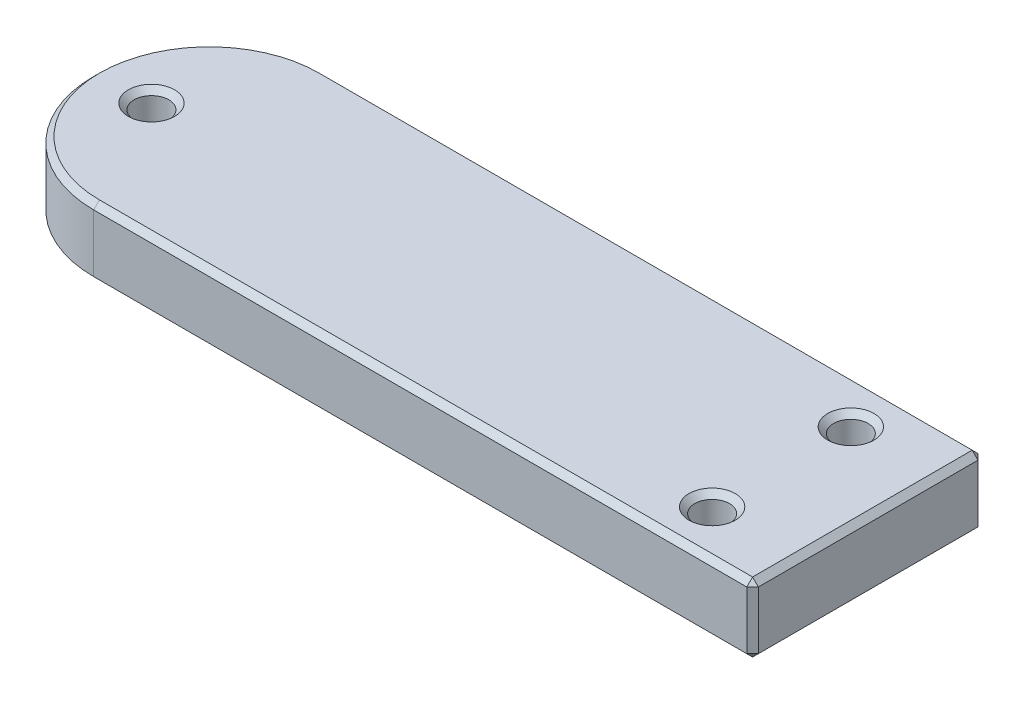
ISO-10303-21;
HEADER;
FILE_DESCRIPTION(('STEP AP214'),'2;1');
FILE_NAME('part.step','',(''),(''),'','','');
FILE_SCHEMA(('AUTOMOTIVE_DESIGN { 1 0 10303 214 1 1 1 1 }'));
ENDSEC;
DATA;
#1=APPLICATION_CONTEXT('core data for automotive mechanical design processes');
#2=APPLICATION_PROTOCOL_DEFINITION('international standard','automotive_design',2000,#1);
#3=PRODUCT_CONTEXT('',#1,'mechanical');
#4=PRODUCT('Part','Part','',(#3));
#5=PRODUCT_RELATED_PRODUCT_CATEGORY('part','',(#4));
#6=PRODUCT_DEFINITION_FORMATION('','',#4);
#7=PRODUCT_DEFINITION_CONTEXT('part definition',#1,'design');
#8=PRODUCT_DEFINITION('design','',#6,#7);
#9=PRODUCT_DEFINITION_SHAPE('','',#8);
#10=(LENGTH_UNIT() NAMED_UNIT(*) SI_UNIT(.MILLI.,.METRE.));
#11=(NAMED_UNIT(*) PLANE_ANGLE_UNIT() SI_UNIT($,.RADIAN.));
#12=(NAMED_UNIT(*) SI_UNIT($,.STERADIAN.) SOLID_ANGLE_UNIT());
#13=UNCERTAINTY_MEASURE_WITH_UNIT(LENGTH_MEASURE(1.E-05),#10,'distance_accuracy_value','');
#14=(GEOMETRIC_REPRESENTATION_CONTEXT(3) GLOBAL_UNCERTAINTY_ASSIGNED_CONTEXT((#13)) GLOBAL_UNIT_ASSIGNED_CONTEXT((#10,
#11,#12)) REPRESENTATION_CONTEXT('',''));
#15=CARTESIAN_POINT('',(0.,0.,0.));
#16=DIRECTION('',(0.,0.,1.));
#17=DIRECTION('',(1.,0.,0.));
#18=AXIS2_PLACEMENT_3D('',#15,#16,#17);
#19=CARTESIAN_POINT('',(0.,6.,0.));
#20=DIRECTION('',(0.,-1.,0.));
#21=DIRECTION('',(0.,0.,-1.));
#22=AXIS2_PLACEMENT_3D('',#19,#20,#21);
#23=PLANE('',#22);
#24=CARTESIAN_POINT('',(54.5,6.,6.));
#25=DIRECTION('',(0.,-1.,0.));
#26=DIRECTION('',(0.,0.,-1.));
#27=AXIS2_PLACEMENT_3D('',#24,#25,#26);
#28=CIRCLE('',#27,1.99999999999999);
#29=CARTESIAN_POINT('',(54.5,6.,4.00000000000001));
#30=VERTEX_POINT('',#29);
#31=EDGE_CURVE('E213',#30,#30,#28,.T.);
#32=ORIENTED_EDGE('',*,*,#31,.T.);
#33=EDGE_LOOP('',(#32));
#34=FACE_BOUND('',#33,.T.);
#35=CARTESIAN_POINT('',(0.,6.,0.));
#36=DIRECTION('',(0.,-1.,0.));
#37=DIRECTION('',(0.,0.,-1.));
#38=AXIS2_PLACEMENT_3D('',#35,#36,#37);
#39=CIRCLE('',#38,1.99999999999999);
#40=CARTESIAN_POINT('',(0.,6.,-1.99999999999999));
#41=VERTEX_POINT('',#40);
#42=EDGE_CURVE('E216',#41,#41,#39,.T.);
#43=ORIENTED_EDGE('',*,*,#42,.T.);
#44=EDGE_LOOP('',(#43));
#45=FACE_BOUND('',#44,.T.);
#46=DIRECTION('',(1.,0.,0.));
#47=VECTOR('',#46,1.);
#48=CARTESIAN_POINT('',(0.,6.,9.5));
#49=LINE('',#48,#47);
#50=CARTESIAN_POINT('',(5.,6.,9.5));
#51=VERTEX_POINT('',#50);
#52=CARTESIAN_POINT('',(61.5,6.,9.49999999999999));
#53=VERTEX_POINT('',#52);
#54=EDGE_CURVE('E222',#51,#53,#49,.T.);
#55=ORIENTED_EDGE('',*,*,#54,.T.);
#56=DIRECTION('',(0.,0.,-1.));
#57=VECTOR('',#56,1.);
#58=CARTESIAN_POINT('',(61.5,6.,0.));
#59=LINE('',#58,#57);
#60=CARTESIAN_POINT('',(61.5,6.,-9.49999999999999));
#61=VERTEX_POINT('',#60);
#62=EDGE_CURVE('E219',#53,#61,#59,.T.);
#63=ORIENTED_EDGE('',*,*,#62,.T.);
#64=DIRECTION('',(-1.,0.,0.));
#65=VECTOR('',#64,1.);
#66=CARTESIAN_POINT('',(0.,6.,-9.49999999999998));
#67=LINE('',#66,#65);
#68=CARTESIAN_POINT('',(5.,6.,-9.49999999999998));
#69=VERTEX_POINT('',#68);
#70=EDGE_CURVE('E228',#61,#69,#67,.T.);
#71=ORIENTED_EDGE('',*,*,#70,.T.);
#72=CARTESIAN_POINT('',(5.,6.,0.));
#73=DIRECTION('',(0.,-1.,0.));
#74=DIRECTION('',(0.,0.,-1.));
#75=AXIS2_PLACEMENT_3D('',#72,#73,#74);
#76=CIRCLE('',#75,9.49999999999999);
#77=CARTESIAN_POINT('',(-4.49999999999999,6.,0.));
#78=VERTEX_POINT('',#77);
#79=EDGE_CURVE('E226',#69,#78,#76,.F.);
#80=ORIENTED_EDGE('',*,*,#79,.T.);
#81=CARTESIAN_POINT('',(5.,6.,0.));
#82=DIRECTION('',(0.,-1.,0.));
#83=DIRECTION('',(0.,0.,-1.));
#84=AXIS2_PLACEMENT_3D('',#81,#82,#83);
#85=CIRCLE('',#84,9.49999999999999);
#86=EDGE_CURVE('E224',#78,#51,#85,.F.);
#87=ORIENTED_EDGE('',*,*,#86,.T.);
#88=EDGE_LOOP('',(#55,#63,#71,#80,#87));
#89=FACE_BOUND('',#88,.T.);
#90=CARTESIAN_POINT('',(54.5,6.,-6.));
#91=DIRECTION('',(0.,-1.,0.));
#92=DIRECTION('',(0.,0.,-1.));
#93=AXIS2_PLACEMENT_3D('',#90,#91,#92);
#94=CIRCLE('',#93,1.99999999999999);
#95=CARTESIAN_POINT('',(54.5,6.,-7.99999999999999));
#96=VERTEX_POINT('',#95);
#97=EDGE_CURVE('E230',#96,#96,#94,.T.);
#98=ORIENTED_EDGE('',*,*,#97,.T.);
#99=EDGE_LOOP('',(#98));
#100=FACE_BOUND('',#99,.T.);
#101=ADVANCED_FACE('F32',(#34,#45,#89,#100),#23,.F.);
#102=CARTESIAN_POINT('',(0.,0.,0.));
#103=DIRECTION('',(0.,-1.,0.));
#104=DIRECTION('',(0.,0.,-1.));
#105=AXIS2_PLACEMENT_3D('',#102,#103,#104);
#106=PLANE('',#105);
#107=CARTESIAN_POINT('',(54.5,0.,6.));
#108=DIRECTION('',(0.,-1.,0.));
#109=DIRECTION('',(0.,0.,-1.));
#110=AXIS2_PLACEMENT_3D('',#107,#108,#109);
#111=CIRCLE('',#110,2.);
#112=CARTESIAN_POINT('',(54.5,0.,4.));
#113=VERTEX_POINT('',#112);
#114=EDGE_CURVE('E251',#113,#113,#111,.F.);
#115=ORIENTED_EDGE('',*,*,#114,.T.);
#116=EDGE_LOOP('',(#115));
#117=FACE_BOUND('',#116,.T.);
#118=CARTESIAN_POINT('',(0.,0.,0.));
#119=DIRECTION('',(0.,-1.,0.));
#120=DIRECTION('',(0.,0.,-1.));
#121=AXIS2_PLACEMENT_3D('',#118,#119,#120);
#122=CIRCLE('',#121,2.);
#123=CARTESIAN_POINT('',(0.,0.,-2.));
#124=VERTEX_POINT('',#123);
#125=EDGE_CURVE('E254',#124,#124,#122,.F.);
#126=ORIENTED_EDGE('',*,*,#125,.T.);
#127=EDGE_LOOP('',(#126));
#128=FACE_BOUND('',#127,.T.);
#129=CARTESIAN_POINT('',(54.5,0.,-6.));
#130=DIRECTION('',(0.,-1.,0.));
#131=DIRECTION('',(0.,0.,-1.));
#132=AXIS2_PLACEMENT_3D('',#129,#130,#131);
#133=CIRCLE('',#132,2.);
#134=CARTESIAN_POINT('',(54.5,0.,-8.));
#135=VERTEX_POINT('',#134);
#136=EDGE_CURVE('E257',#135,#135,#133,.F.);
#137=ORIENTED_EDGE('',*,*,#136,.T.);
#138=EDGE_LOOP('',(#137));
#139=FACE_BOUND('',#138,.T.);
#140=DIRECTION('',(0.,0.,1.));
#141=VECTOR('',#140,1.);
#142=CARTESIAN_POINT('',(61.5,0.,10.));
#143=LINE('',#142,#141);
#144=CARTESIAN_POINT('',(61.5,0.,-9.49999999999999));
#145=VERTEX_POINT('',#144);
#146=CARTESIAN_POINT('',(61.5,0.,9.49999999999999));
#147=VERTEX_POINT('',#146);
#148=EDGE_CURVE('E262',#145,#147,#143,.T.);
#149=ORIENTED_EDGE('',*,*,#148,.T.);
#150=DIRECTION('',(-1.,0.,0.));
#151=VECTOR('',#150,1.);
#152=CARTESIAN_POINT('',(5.,0.,9.5));
#153=LINE('',#152,#151);
#154=CARTESIAN_POINT('',(5.,0.,9.5));
#155=VERTEX_POINT('',#154);
#156=EDGE_CURVE('E260',#147,#155,#153,.T.);
#157=ORIENTED_EDGE('',*,*,#156,.T.);
#158=CARTESIAN_POINT('',(5.,0.,0.));
#159=DIRECTION('',(0.,-1.,0.));
#160=DIRECTION('',(0.,0.,-1.));
#161=AXIS2_PLACEMENT_3D('',#158,#159,#160);
#162=CIRCLE('',#161,9.49999999999999);
#163=CARTESIAN_POINT('',(-4.49999999999999,0.,0.));
#164=VERTEX_POINT('',#163);
#165=EDGE_CURVE('E126',#155,#164,#162,.T.);
#166=ORIENTED_EDGE('',*,*,#165,.T.);
#167=CARTESIAN_POINT('',(5.,0.,0.));
#168=DIRECTION('',(0.,-1.,0.));
#169=DIRECTION('',(0.,0.,-1.));
#170=AXIS2_PLACEMENT_3D('',#167,#168,#169);
#171=CIRCLE('',#170,9.49999999999999);
#172=CARTESIAN_POINT('',(5.,0.,-9.49999999999999));
#173=VERTEX_POINT('',#172);
#174=EDGE_CURVE('E119',#164,#173,#171,.T.);
#175=ORIENTED_EDGE('',*,*,#174,.T.);
#176=DIRECTION('',(1.,0.,0.));
#177=VECTOR('',#176,1.);
#178=CARTESIAN_POINT('',(62.,0.,-9.49999999999999));
#179=LINE('',#178,#177);
#180=EDGE_CURVE('E122',#173,#145,#179,.T.);
#181=ORIENTED_EDGE('',*,*,#180,.T.);
#182=EDGE_LOOP('',(#149,#157,#166,#175,#181));
#183=FACE_BOUND('',#182,.T.);
#184=ADVANCED_FACE('F121',(#117,#128,#139,#183),#106,.T.);
#185=CARTESIAN_POINT('',(62.,6.,-10.));
#186=DIRECTION('',(-1.,0.,0.));
#187=DIRECTION('',(0.,0.,1.));
#188=AXIS2_PLACEMENT_3D('',#185,#186,#187);
#189=PLANE('',#188);
#190=DIRECTION('',(0.,0.,1.));
#191=VECTOR('',#190,1.);
#192=CARTESIAN_POINT('',(62.,5.49999999999999,-10.));
#193=LINE('',#192,#191);
#194=CARTESIAN_POINT('',(62.,5.49999999999999,-9.49999999999999));
#195=VERTEX_POINT('',#194);
#196=CARTESIAN_POINT('',(62.,5.49999999999999,9.49999999999999));
#197=VERTEX_POINT('',#196);
#198=EDGE_CURVE('E211',#195,#197,#193,.T.);
#199=ORIENTED_EDGE('',*,*,#198,.T.);
#200=DIRECTION('',(0.,-1.,0.));
#201=VECTOR('',#200,1.);
#202=CARTESIAN_POINT('',(62.,6.,9.49999999999999));
#203=LINE('',#202,#201);
#204=CARTESIAN_POINT('',(62.,0.500000000000007,9.49999999999999));
#205=VERTEX_POINT('',#204);
#206=EDGE_CURVE('E204',#197,#205,#203,.T.);
#207=ORIENTED_EDGE('',*,*,#206,.T.);
#208=DIRECTION('',(0.,0.,-1.));
#209=VECTOR('',#208,1.);
#210=CARTESIAN_POINT('',(62.,0.500000000000007,-10.));
#211=LINE('',#210,#209);
#212=CARTESIAN_POINT('',(62.,0.500000000000007,-9.49999999999999));
#213=VERTEX_POINT('',#212);
#214=EDGE_CURVE('E207',#205,#213,#211,.T.);
#215=ORIENTED_EDGE('',*,*,#214,.T.);
#216=DIRECTION('',(0.,1.,0.));
#217=VECTOR('',#216,1.);
#218=CARTESIAN_POINT('',(62.,6.,-9.49999999999999));
#219=LINE('',#218,#217);
#220=EDGE_CURVE('E209',#213,#195,#219,.T.);
#221=ORIENTED_EDGE('',*,*,#220,.T.);
#222=EDGE_LOOP('',(#199,#207,#215,#221));
#223=FACE_BOUND('',#222,.T.);
#224=ADVANCED_FACE('F345',(#223),#189,.F.);
#225=CARTESIAN_POINT('',(62.,6.,-10.));
#226=DIRECTION('',(0.,0.,1.));
#227=DIRECTION('',(1.,0.,0.));
#228=AXIS2_PLACEMENT_3D('',#225,#226,#227);
#229=PLANE('',#228);
#230=DIRECTION('',(0.,-1.,0.));
#231=VECTOR('',#230,1.);
#232=CARTESIAN_POINT('',(61.5,6.,-10.));
#233=LINE('',#232,#231);
#234=CARTESIAN_POINT('',(61.5,5.49999999999999,-10.));
#235=VERTEX_POINT('',#234);
#236=CARTESIAN_POINT('',(61.5,0.500000000000007,-10.));
#237=VERTEX_POINT('',#236);
#238=EDGE_CURVE('E41',#235,#237,#233,.T.);
#239=ORIENTED_EDGE('',*,*,#238,.T.);
#240=DIRECTION('',(-1.,0.,0.));
#241=VECTOR('',#240,1.);
#242=CARTESIAN_POINT('',(5.,0.500000000000007,-9.99999999999999));
#243=LINE('',#242,#241);
#244=CARTESIAN_POINT('',(5.,0.500000000000007,-9.99999999999999));
#245=VERTEX_POINT('',#244);
#246=EDGE_CURVE('E11',#237,#245,#243,.T.);
#247=ORIENTED_EDGE('',*,*,#246,.T.);
#248=DIRECTION('',(0.,-1.,0.));
#249=VECTOR('',#248,1.);
#250=CARTESIAN_POINT('',(5.,6.,-9.99999999999999));
#251=LINE('',#250,#249);
#252=CARTESIAN_POINT('',(5.,5.49999999999999,-9.99999999999999));
#253=VERTEX_POINT('',#252);
#254=EDGE_CURVE('E267',#245,#253,#251,.F.);
#255=ORIENTED_EDGE('',*,*,#254,.T.);
#256=DIRECTION('',(1.,0.,0.));
#257=VECTOR('',#256,1.);
#258=CARTESIAN_POINT('',(62.,5.49999999999999,-10.));
#259=LINE('',#258,#257);
#260=EDGE_CURVE('E52',#253,#235,#259,.T.);
#261=ORIENTED_EDGE('',*,*,#260,.T.);
#262=EDGE_LOOP('',(#239,#247,#255,#261));
#263=FACE_BOUND('',#262,.T.);
#264=ADVANCED_FACE('F272',(#263),#229,.F.);
#265=CARTESIAN_POINT('',(62.,6.,10.));
#266=DIRECTION('',(0.,0.,-1.));
#267=DIRECTION('',(-1.,0.,0.));
#268=AXIS2_PLACEMENT_3D('',#265,#266,#267);
#269=PLANE('',#268);
#270=DIRECTION('',(0.,-1.,0.));
#271=VECTOR('',#270,1.);
#272=CARTESIAN_POINT('',(5.,6.,10.));
#273=LINE('',#272,#271);
#274=CARTESIAN_POINT('',(5.,5.49999999999999,10.));
#275=VERTEX_POINT('',#274);
#276=CARTESIAN_POINT('',(5.,0.500000000000007,10.));
#277=VERTEX_POINT('',#276);
#278=EDGE_CURVE('E140',#275,#277,#273,.T.);
#279=ORIENTED_EDGE('',*,*,#278,.T.);
#280=DIRECTION('',(1.,0.,0.));
#281=VECTOR('',#280,1.);
#282=CARTESIAN_POINT('',(62.,0.500000000000007,10.));
#283=LINE('',#282,#281);
#284=CARTESIAN_POINT('',(61.5,0.500000000000007,10.));
#285=VERTEX_POINT('',#284);
#286=EDGE_CURVE('E197',#277,#285,#283,.T.);
#287=ORIENTED_EDGE('',*,*,#286,.T.);
#288=DIRECTION('',(0.,1.,0.));
#289=VECTOR('',#288,1.);
#290=CARTESIAN_POINT('',(61.5,6.,10.));
#291=LINE('',#290,#289);
#292=CARTESIAN_POINT('',(61.5,5.49999999999999,10.));
#293=VERTEX_POINT('',#292);
#294=EDGE_CURVE('E199',#285,#293,#291,.T.);
#295=ORIENTED_EDGE('',*,*,#294,.T.);
#296=DIRECTION('',(-1.,0.,0.));
#297=VECTOR('',#296,1.);
#298=CARTESIAN_POINT('',(62.,5.49999999999999,10.));
#299=LINE('',#298,#297);
#300=EDGE_CURVE('E202',#293,#275,#299,.T.);
#301=ORIENTED_EDGE('',*,*,#300,.T.);
#302=EDGE_LOOP('',(#279,#287,#295,#301));
#303=FACE_BOUND('',#302,.T.);
#304=ADVANCED_FACE('F315',(#303),#269,.F.);
#305=CARTESIAN_POINT('',(0.,6.,0.));
#306=DIRECTION('',(0.,-1.,0.));
#307=DIRECTION('',(0.,0.,-1.));
#308=AXIS2_PLACEMENT_3D('',#305,#306,#307);
#309=CYLINDRICAL_SURFACE('',#308,1.5);
#310=CARTESIAN_POINT('',(0.,0.500000000000003,0.));
#311=DIRECTION('',(0.,-1.,0.));
#312=DIRECTION('',(0.,0.,-1.));
#313=AXIS2_PLACEMENT_3D('',#310,#311,#312);
#314=CIRCLE('',#313,1.5);
#315=CARTESIAN_POINT('',(0.,0.500000000000003,-1.5));
#316=VERTEX_POINT('',#315);
#317=EDGE_CURVE('E239',#316,#316,#314,.T.);
#318=ORIENTED_EDGE('',*,*,#317,.T.);
#319=EDGE_LOOP('',(#318));
#320=FACE_BOUND('',#319,.T.);
#321=CARTESIAN_POINT('',(0.,5.50000000000001,0.));
#322=DIRECTION('',(0.,-1.,0.));
#323=DIRECTION('',(0.,0.,-1.));
#324=AXIS2_PLACEMENT_3D('',#321,#322,#323);
#325=CIRCLE('',#324,1.5);
#326=CARTESIAN_POINT('',(0.,5.50000000000001,-1.5));
#327=VERTEX_POINT('',#326);
#328=EDGE_CURVE('E242',#327,#327,#325,.F.);
#329=ORIENTED_EDGE('',*,*,#328,.T.);
#330=EDGE_LOOP('',(#329));
#331=FACE_BOUND('',#330,.T.);
#332=ADVANCED_FACE('F350',(#320,#331),#309,.F.);
#333=CARTESIAN_POINT('',(54.5,6.,-6.));
#334=DIRECTION('',(0.,-1.,0.));
#335=DIRECTION('',(0.,0.,-1.));
#336=AXIS2_PLACEMENT_3D('',#333,#334,#335);
#337=CYLINDRICAL_SURFACE('',#336,1.5);
#338=CARTESIAN_POINT('',(54.5,0.5,-6.));
#339=DIRECTION('',(0.,-1.,0.));
#340=DIRECTION('',(0.,0.,-1.));
#341=AXIS2_PLACEMENT_3D('',#338,#339,#340);
#342=CIRCLE('',#341,1.5);
#343=CARTESIAN_POINT('',(54.5,0.5,-7.5));
#344=VERTEX_POINT('',#343);
#345=EDGE_CURVE('E233',#344,#344,#342,.T.);
#346=ORIENTED_EDGE('',*,*,#345,.T.);
#347=EDGE_LOOP('',(#346));
#348=FACE_BOUND('',#347,.T.);
#349=CARTESIAN_POINT('',(54.5,5.5,-6.));
#350=DIRECTION('',(0.,-1.,0.));
#351=DIRECTION('',(0.,0.,-1.));
#352=AXIS2_PLACEMENT_3D('',#349,#350,#351);
#353=CIRCLE('',#352,1.5);
#354=CARTESIAN_POINT('',(54.5,5.5,-7.5));
#355=VERTEX_POINT('',#354);
#356=EDGE_CURVE('E236',#355,#355,#353,.F.);
#357=ORIENTED_EDGE('',*,*,#356,.T.);
#358=EDGE_LOOP('',(#357));
#359=FACE_BOUND('',#358,.T.);
#360=ADVANCED_FACE('F439',(#348,#359),#337,.F.);
#361=CARTESIAN_POINT('',(54.5,6.,6.));
#362=DIRECTION('',(0.,-1.,0.));
#363=DIRECTION('',(0.,0.,-1.));
#364=AXIS2_PLACEMENT_3D('',#361,#362,#363);
#365=CYLINDRICAL_SURFACE('',#364,1.5);
#366=CARTESIAN_POINT('',(54.5,0.5,6.));
#367=DIRECTION('',(0.,-1.,0.));
#368=DIRECTION('',(0.,0.,-1.));
#369=AXIS2_PLACEMENT_3D('',#366,#367,#368);
#370=CIRCLE('',#369,1.5);
#371=CARTESIAN_POINT('',(54.5,0.5,4.5));
#372=VERTEX_POINT('',#371);
#373=EDGE_CURVE('E245',#372,#372,#370,.T.);
#374=ORIENTED_EDGE('',*,*,#373,.T.);
#375=EDGE_LOOP('',(#374));
#376=FACE_BOUND('',#375,.T.);
#377=CARTESIAN_POINT('',(54.5,5.5,6.));
#378=DIRECTION('',(0.,-1.,0.));
#379=DIRECTION('',(0.,0.,-1.));
#380=AXIS2_PLACEMENT_3D('',#377,#378,#379);
#381=CIRCLE('',#380,1.5);
#382=CARTESIAN_POINT('',(54.5,5.5,4.5));
#383=VERTEX_POINT('',#382);
#384=EDGE_CURVE('E248',#383,#383,#381,.F.);
#385=ORIENTED_EDGE('',*,*,#384,.T.);
#386=EDGE_LOOP('',(#385));
#387=FACE_BOUND('',#386,.T.);
#388=ADVANCED_FACE('F336',(#376,#387),#365,.F.);
#389=CARTESIAN_POINT('',(5.,6.,0.));
#390=DIRECTION('',(0.,-1.,0.));
#391=DIRECTION('',(0.,0.,-1.));
#392=AXIS2_PLACEMENT_3D('',#389,#390,#391);
#393=CYLINDRICAL_SURFACE('',#392,10.);
#394=DIRECTION('',(0.,-1.,0.));
#395=VECTOR('',#394,1.);
#396=CARTESIAN_POINT('',(-5.,6.,0.));
#397=LINE('',#396,#395);
#398=CARTESIAN_POINT('',(-5.,0.500000000000007,0.));
#399=VERTEX_POINT('',#398);
#400=CARTESIAN_POINT('',(-5.,5.49999999999999,0.));
#401=VERTEX_POINT('',#400);
#402=EDGE_CURVE('E146',#399,#401,#397,.F.);
#403=ORIENTED_EDGE('',*,*,#402,.F.);
#404=CARTESIAN_POINT('',(5.,0.500000000000007,0.));
#405=DIRECTION('',(0.,-1.,0.));
#406=DIRECTION('',(0.,0.,-1.));
#407=AXIS2_PLACEMENT_3D('',#404,#405,#406);
#408=CIRCLE('',#407,10.);
#409=EDGE_CURVE('E193',#399,#277,#408,.F.);
#410=ORIENTED_EDGE('',*,*,#409,.T.);
#411=ORIENTED_EDGE('',*,*,#278,.F.);
#412=CARTESIAN_POINT('',(5.,5.49999999999999,0.));
#413=DIRECTION('',(0.,-1.,0.));
#414=DIRECTION('',(0.,0.,-1.));
#415=AXIS2_PLACEMENT_3D('',#412,#413,#414);
#416=CIRCLE('',#415,10.);
#417=EDGE_CURVE('E195',#275,#401,#416,.T.);
#418=ORIENTED_EDGE('',*,*,#417,.T.);
#419=EDGE_LOOP('',(#403,#410,#411,#418));
#420=FACE_BOUND('',#419,.T.);
#421=ADVANCED_FACE('F312',(#420),#393,.T.);
#422=CARTESIAN_POINT('',(5.,6.,0.));
#423=DIRECTION('',(0.,-1.,0.));
#424=DIRECTION('',(0.,0.,-1.));
#425=AXIS2_PLACEMENT_3D('',#422,#423,#424);
#426=CYLINDRICAL_SURFACE('',#425,10.);
#427=ORIENTED_EDGE('',*,*,#254,.F.);
#428=CARTESIAN_POINT('',(5.,0.500000000000007,0.));
#429=DIRECTION('',(0.,-1.,0.));
#430=DIRECTION('',(0.,0.,-1.));
#431=AXIS2_PLACEMENT_3D('',#428,#429,#430);
#432=CIRCLE('',#431,10.);
#433=EDGE_CURVE('E143',#245,#399,#432,.F.);
#434=ORIENTED_EDGE('',*,*,#433,.T.);
#435=ORIENTED_EDGE('',*,*,#402,.T.);
#436=CARTESIAN_POINT('',(5.,5.49999999999999,0.));
#437=DIRECTION('',(0.,-1.,0.));
#438=DIRECTION('',(0.,0.,-1.));
#439=AXIS2_PLACEMENT_3D('',#436,#437,#438);
#440=CIRCLE('',#439,10.);
#441=EDGE_CURVE('E191',#401,#253,#440,.T.);
#442=ORIENTED_EDGE('',*,*,#441,.T.);
#443=EDGE_LOOP('',(#427,#434,#435,#442));
#444=FACE_BOUND('',#443,.T.);
#445=ADVANCED_FACE('F325',(#444),#426,.T.);
#446=CARTESIAN_POINT('',(54.5,0.,6.));
#447=DIRECTION('',(0.,-1.,0.));
#448=DIRECTION('',(0.,0.,-1.));
#449=AXIS2_PLACEMENT_3D('',#446,#447,#448);
#450=CONICAL_SURFACE('',#449,2.,0.785398163397447);
#451=ORIENTED_EDGE('',*,*,#373,.F.);
#452=EDGE_LOOP('',(#451));
#453=FACE_BOUND('',#452,.T.);
#454=ORIENTED_EDGE('',*,*,#114,.F.);
#455=EDGE_LOOP('',(#454));
#456=FACE_BOUND('',#455,.T.);
#457=ADVANCED_FACE('F327',(#453,#456),#450,.F.);
#458=CARTESIAN_POINT('',(0.,0.,0.));
#459=DIRECTION('',(0.,-1.,0.));
#460=DIRECTION('',(0.,0.,-1.));
#461=AXIS2_PLACEMENT_3D('',#458,#459,#460);
#462=CONICAL_SURFACE('',#461,2.,0.785398163397447);
#463=ORIENTED_EDGE('',*,*,#317,.F.);
#464=EDGE_LOOP('',(#463));
#465=FACE_BOUND('',#464,.T.);
#466=ORIENTED_EDGE('',*,*,#125,.F.);
#467=EDGE_LOOP('',(#466));
#468=FACE_BOUND('',#467,.T.);
#469=ADVANCED_FACE('F333',(#465,#468),#462,.F.);
#470=CARTESIAN_POINT('',(54.5,0.,-6.));
#471=DIRECTION('',(0.,-1.,0.));
#472=DIRECTION('',(0.,0.,-1.));
#473=AXIS2_PLACEMENT_3D('',#470,#471,#472);
#474=CONICAL_SURFACE('',#473,2.,0.785398163397447);
#475=ORIENTED_EDGE('',*,*,#345,.F.);
#476=EDGE_LOOP('',(#475));
#477=FACE_BOUND('',#476,.T.);
#478=ORIENTED_EDGE('',*,*,#136,.F.);
#479=EDGE_LOOP('',(#478));
#480=FACE_BOUND('',#479,.T.);
#481=ADVANCED_FACE('F416',(#477,#480),#474,.F.);
#482=CARTESIAN_POINT('',(54.5,5.5,6.));
#483=DIRECTION('',(0.,1.,0.));
#484=DIRECTION('',(0.,0.,1.));
#485=AXIS2_PLACEMENT_3D('',#482,#483,#484);
#486=CONICAL_SURFACE('',#485,1.5,0.785398163397443);
#487=ORIENTED_EDGE('',*,*,#31,.F.);
#488=EDGE_LOOP('',(#487));
#489=FACE_BOUND('',#488,.T.);
#490=ORIENTED_EDGE('',*,*,#384,.F.);
#491=EDGE_LOOP('',(#490));
#492=FACE_BOUND('',#491,.T.);
#493=ADVANCED_FACE('F411',(#489,#492),#486,.F.);
#494=CARTESIAN_POINT('',(0.,5.50000000000001,0.));
#495=DIRECTION('',(0.,1.,0.));
#496=DIRECTION('',(0.,0.,1.));
#497=AXIS2_PLACEMENT_3D('',#494,#495,#496);
#498=CONICAL_SURFACE('',#497,1.5,0.785398163397449);
#499=ORIENTED_EDGE('',*,*,#42,.F.);
#500=EDGE_LOOP('',(#499));
#501=FACE_BOUND('',#500,.T.);
#502=ORIENTED_EDGE('',*,*,#328,.F.);
#503=EDGE_LOOP('',(#502));
#504=FACE_BOUND('',#503,.T.);
#505=ADVANCED_FACE('F407',(#501,#504),#498,.F.);
#506=CARTESIAN_POINT('',(5.,6.,0.));
#507=DIRECTION('',(0.,-1.,0.));
#508=DIRECTION('',(0.,0.,-1.));
#509=AXIS2_PLACEMENT_3D('',#506,#507,#508);
#510=CONICAL_SURFACE('',#509,9.49999999999999,0.785398163397448);
#511=DIRECTION('',(-0.707106781186547,-0.707106781186547,0.));
#512=VECTOR('',#511,1.);
#513=CARTESIAN_POINT('',(-4.49999999999999,6.,0.));
#514=LINE('',#513,#512);
#515=EDGE_CURVE('E144',#78,#401,#514,.T.);
#516=ORIENTED_EDGE('',*,*,#515,.F.);
#517=ORIENTED_EDGE('',*,*,#79,.F.);
#518=DIRECTION('',(0.,0.707106781186547,0.707106781186547));
#519=VECTOR('',#518,1.);
#520=CARTESIAN_POINT('',(5.,5.49999999999999,-9.99999999999999));
#521=LINE('',#520,#519);
#522=EDGE_CURVE('E36',#253,#69,#521,.T.);
#523=ORIENTED_EDGE('',*,*,#522,.F.);
#524=ORIENTED_EDGE('',*,*,#441,.F.);
#525=EDGE_LOOP('',(#516,#517,#523,#524));
#526=FACE_BOUND('',#525,.T.);
#527=ADVANCED_FACE('F278',(#526),#510,.T.);
#528=CARTESIAN_POINT('',(0.,6.,-9.49999999999998));
#529=DIRECTION('',(0.,-0.707106781186548,0.707106781186547));
#530=DIRECTION('',(-1.,0.,0.));
#531=AXIS2_PLACEMENT_3D('',#528,#529,#530);
#532=PLANE('',#531);
#533=ORIENTED_EDGE('',*,*,#522,.T.);
#534=ORIENTED_EDGE('',*,*,#70,.F.);
#535=DIRECTION('',(0.,-0.707106781186547,-0.707106781186548));
#536=VECTOR('',#535,1.);
#537=CARTESIAN_POINT('',(61.5,5.75,-9.74999999999999));
#538=LINE('',#537,#536);
#539=EDGE_CURVE('E148',#235,#61,#538,.F.);
#540=ORIENTED_EDGE('',*,*,#539,.F.);
#541=ORIENTED_EDGE('',*,*,#260,.F.);
#542=EDGE_LOOP('',(#533,#534,#540,#541));
#543=FACE_BOUND('',#542,.T.);
#544=ADVANCED_FACE('F282',(#543),#532,.F.);
#545=CARTESIAN_POINT('',(61.5,6.,-10.));
#546=DIRECTION('',(-0.707106781186547,0.,0.707106781186547));
#547=DIRECTION('',(0.,-1.,0.));
#548=AXIS2_PLACEMENT_3D('',#545,#546,#547);
#549=PLANE('',#548);
#550=DIRECTION('',(-0.707106781186547,0.,-0.707106781186547));
#551=VECTOR('',#550,1.);
#552=CARTESIAN_POINT('',(62.,0.500000000000007,-9.49999999999999));
#553=LINE('',#552,#551);
#554=EDGE_CURVE('E156',#237,#213,#553,.F.);
#555=ORIENTED_EDGE('',*,*,#554,.F.);
#556=ORIENTED_EDGE('',*,*,#238,.F.);
#557=DIRECTION('',(0.707106781186548,0.,0.707106781186548));
#558=VECTOR('',#557,1.);
#559=CARTESIAN_POINT('',(62.,5.49999999999999,-9.49999999999999));
#560=LINE('',#559,#558);
#561=EDGE_CURVE('E153',#195,#235,#560,.F.);
#562=ORIENTED_EDGE('',*,*,#561,.F.);
#563=ORIENTED_EDGE('',*,*,#220,.F.);
#564=EDGE_LOOP('',(#555,#556,#562,#563));
#565=FACE_BOUND('',#564,.T.);
#566=ADVANCED_FACE('F291',(#565),#549,.F.);
#567=CARTESIAN_POINT('',(62.,0.500000000000007,-10.));
#568=DIRECTION('',(0.,-0.707106781186548,-0.707106781186547));
#569=DIRECTION('',(1.,0.,0.));
#570=AXIS2_PLACEMENT_3D('',#567,#568,#569);
#571=PLANE('',#570);
#572=DIRECTION('',(0.,0.707106781186547,-0.707106781186548));
#573=VECTOR('',#572,1.);
#574=CARTESIAN_POINT('',(61.5,0.250000000000003,-9.74999999999999));
#575=LINE('',#574,#573);
#576=EDGE_CURVE('E138',#145,#237,#575,.T.);
#577=ORIENTED_EDGE('',*,*,#576,.F.);
#578=ORIENTED_EDGE('',*,*,#180,.F.);
#579=DIRECTION('',(0.,-0.707106781186548,0.707106781186547));
#580=VECTOR('',#579,1.);
#581=CARTESIAN_POINT('',(5.,0.500000000000007,-9.99999999999999));
#582=LINE('',#581,#580);
#583=EDGE_CURVE('E135',#245,#173,#582,.T.);
#584=ORIENTED_EDGE('',*,*,#583,.F.);
#585=ORIENTED_EDGE('',*,*,#246,.F.);
#586=EDGE_LOOP('',(#577,#578,#584,#585));
#587=FACE_BOUND('',#586,.T.);
#588=ADVANCED_FACE('F134',(#587),#571,.T.);
#589=CARTESIAN_POINT('',(5.,0.,0.));
#590=DIRECTION('',(0.,1.,0.));
#591=DIRECTION('',(0.,0.,1.));
#592=AXIS2_PLACEMENT_3D('',#589,#590,#591);
#593=CONICAL_SURFACE('',#592,9.49999999999999,0.785398163397448);
#594=ORIENTED_EDGE('',*,*,#583,.T.);
#595=ORIENTED_EDGE('',*,*,#174,.F.);
#596=DIRECTION('',(0.707106781186547,-0.707106781186547,0.));
#597=VECTOR('',#596,1.);
#598=CARTESIAN_POINT('',(-5.,0.500000000000007,0.));
#599=LINE('',#598,#597);
#600=EDGE_CURVE('E160',#399,#164,#599,.T.);
#601=ORIENTED_EDGE('',*,*,#600,.F.);
#602=ORIENTED_EDGE('',*,*,#433,.F.);
#603=EDGE_LOOP('',(#594,#595,#601,#602));
#604=FACE_BOUND('',#603,.T.);
#605=ADVANCED_FACE('F142',(#604),#593,.T.);
#606=CARTESIAN_POINT('',(5.,6.,0.));
#607=DIRECTION('',(0.,-1.,0.));
#608=DIRECTION('',(0.,0.,-1.));
#609=AXIS2_PLACEMENT_3D('',#606,#607,#608);
#610=CONICAL_SURFACE('',#609,9.49999999999999,0.785398163397448);
#611=ORIENTED_EDGE('',*,*,#515,.T.);
#612=ORIENTED_EDGE('',*,*,#417,.F.);
#613=DIRECTION('',(0.,-0.707106781186547,0.707106781186547));
#614=VECTOR('',#613,1.);
#615=CARTESIAN_POINT('',(5.,6.,9.5));
#616=LINE('',#615,#614);
#617=EDGE_CURVE('E162',#51,#275,#616,.T.);
#618=ORIENTED_EDGE('',*,*,#617,.F.);
#619=ORIENTED_EDGE('',*,*,#86,.F.);
#620=EDGE_LOOP('',(#611,#612,#618,#619));
#621=FACE_BOUND('',#620,.T.);
#622=ADVANCED_FACE('F324',(#621),#610,.T.);
#623=CARTESIAN_POINT('',(62.,5.49999999999999,-9.49999999999999));
#624=DIRECTION('',(0.577350269189625,0.577350269189627,-0.577350269189625));
#625=DIRECTION('',(0.,0.707106781186546,0.707106781186549));
#626=AXIS2_PLACEMENT_3D('',#623,#624,#625);
#627=PLANE('',#626);
#628=ORIENTED_EDGE('',*,*,#561,.T.);
#629=ORIENTED_EDGE('',*,*,#539,.T.);
#630=DIRECTION('',(-0.707106781186548,0.707106781186548,0.));
#631=VECTOR('',#630,1.);
#632=CARTESIAN_POINT('',(62.,5.49999999999999,-9.49999999999999));
#633=LINE('',#632,#631);
#634=EDGE_CURVE('E165',#195,#61,#633,.T.);
#635=ORIENTED_EDGE('',*,*,#634,.F.);
#636=EDGE_LOOP('',(#628,#629,#635));
#637=FACE_BOUND('',#636,.T.);
#638=ADVANCED_FACE('F286',(#637),#627,.T.);
#639=CARTESIAN_POINT('',(62.,0.500000000000007,-9.49999999999999));
#640=DIRECTION('',(0.577350269189626,-0.577350269189626,-0.577350269189626));
#641=DIRECTION('',(-0.707106781186548,0.,-0.707106781186547));
#642=AXIS2_PLACEMENT_3D('',#639,#640,#641);
#643=PLANE('',#642);
#644=ORIENTED_EDGE('',*,*,#576,.T.);
#645=ORIENTED_EDGE('',*,*,#554,.T.);
#646=DIRECTION('',(-0.707106781186548,-0.707106781186548,0.));
#647=VECTOR('',#646,1.);
#648=CARTESIAN_POINT('',(62.,0.500000000000007,-9.49999999999999));
#649=LINE('',#648,#647);
#650=EDGE_CURVE('E167',#145,#213,#649,.F.);
#651=ORIENTED_EDGE('',*,*,#650,.F.);
#652=EDGE_LOOP('',(#644,#645,#651));
#653=FACE_BOUND('',#652,.T.);
#654=ADVANCED_FACE('F293',(#653),#643,.T.);
#655=CARTESIAN_POINT('',(5.,0.,0.));
#656=DIRECTION('',(0.,1.,0.));
#657=DIRECTION('',(0.,0.,1.));
#658=AXIS2_PLACEMENT_3D('',#655,#656,#657);
#659=CONICAL_SURFACE('',#658,9.49999999999999,0.785398163397448);
#660=ORIENTED_EDGE('',*,*,#600,.T.);
#661=ORIENTED_EDGE('',*,*,#165,.F.);
#662=DIRECTION('',(0.,-0.707106781186547,-0.707106781186547));
#663=VECTOR('',#662,1.);
#664=CARTESIAN_POINT('',(5.,0.500000000000007,10.));
#665=LINE('',#664,#663);
#666=EDGE_CURVE('E170',#277,#155,#665,.T.);
#667=ORIENTED_EDGE('',*,*,#666,.F.);
#668=ORIENTED_EDGE('',*,*,#409,.F.);
#669=EDGE_LOOP('',(#660,#661,#667,#668));
#670=FACE_BOUND('',#669,.T.);
#671=ADVANCED_FACE('F308',(#670),#659,.T.);
#672=CARTESIAN_POINT('',(0.,6.,9.5));
#673=DIRECTION('',(0.,-0.707106781186547,-0.707106781186548));
#674=DIRECTION('',(1.,0.,0.));
#675=AXIS2_PLACEMENT_3D('',#672,#673,#674);
#676=PLANE('',#675);
#677=ORIENTED_EDGE('',*,*,#617,.T.);
#678=ORIENTED_EDGE('',*,*,#300,.F.);
#679=DIRECTION('',(0.,0.707106781186548,-0.707106781186547));
#680=VECTOR('',#679,1.);
#681=CARTESIAN_POINT('',(61.5,5.49999999999999,10.));
#682=LINE('',#681,#680);
#683=EDGE_CURVE('E172',#53,#293,#682,.F.);
#684=ORIENTED_EDGE('',*,*,#683,.F.);
#685=ORIENTED_EDGE('',*,*,#54,.F.);
#686=EDGE_LOOP('',(#677,#678,#684,#685));
#687=FACE_BOUND('',#686,.T.);
#688=ADVANCED_FACE('F319',(#687),#676,.F.);
#689=CARTESIAN_POINT('',(61.5,6.,0.));
#690=DIRECTION('',(-0.707106781186547,-0.707106781186547,0.));
#691=DIRECTION('',(0.,0.,-1.));
#692=AXIS2_PLACEMENT_3D('',#689,#690,#691);
#693=PLANE('',#692);
#694=ORIENTED_EDGE('',*,*,#634,.T.);
#695=ORIENTED_EDGE('',*,*,#62,.F.);
#696=DIRECTION('',(0.707106781186548,-0.707106781186548,0.));
#697=VECTOR('',#696,1.);
#698=CARTESIAN_POINT('',(61.75,5.75,9.49999999999999));
#699=LINE('',#698,#697);
#700=EDGE_CURVE('E175',#197,#53,#699,.F.);
#701=ORIENTED_EDGE('',*,*,#700,.F.);
#702=ORIENTED_EDGE('',*,*,#198,.F.);
#703=EDGE_LOOP('',(#694,#695,#701,#702));
#704=FACE_BOUND('',#703,.T.);
#705=ADVANCED_FACE('F365',(#704),#693,.F.);
#706=CARTESIAN_POINT('',(62.,0.500000000000007,-10.));
#707=DIRECTION('',(0.707106781186547,-0.707106781186547,0.));
#708=DIRECTION('',(0.,0.,1.));
#709=AXIS2_PLACEMENT_3D('',#706,#707,#708);
#710=PLANE('',#709);
#711=ORIENTED_EDGE('',*,*,#650,.T.);
#712=ORIENTED_EDGE('',*,*,#214,.F.);
#713=DIRECTION('',(0.707106781186547,0.707106781186547,0.));
#714=VECTOR('',#713,1.);
#715=CARTESIAN_POINT('',(62.,0.500000000000007,9.49999999999999));
#716=LINE('',#715,#714);
#717=EDGE_CURVE('E178',#147,#205,#716,.T.);
#718=ORIENTED_EDGE('',*,*,#717,.F.);
#719=ORIENTED_EDGE('',*,*,#148,.F.);
#720=EDGE_LOOP('',(#711,#712,#718,#719));
#721=FACE_BOUND('',#720,.T.);
#722=ADVANCED_FACE('F298',(#721),#710,.T.);
#723=CARTESIAN_POINT('',(62.,0.500000000000007,10.));
#724=DIRECTION('',(0.,-0.707106781186547,0.707106781186548));
#725=DIRECTION('',(-1.,0.,0.));
#726=AXIS2_PLACEMENT_3D('',#723,#724,#725);
#727=PLANE('',#726);
#728=ORIENTED_EDGE('',*,*,#666,.T.);
#729=ORIENTED_EDGE('',*,*,#156,.F.);
#730=DIRECTION('',(0.,-0.707106781186548,-0.707106781186547));
#731=VECTOR('',#730,1.);
#732=CARTESIAN_POINT('',(61.5,0.250000000000002,9.74999999999999));
#733=LINE('',#732,#731);
#734=EDGE_CURVE('E181',#285,#147,#733,.T.);
#735=ORIENTED_EDGE('',*,*,#734,.F.);
#736=ORIENTED_EDGE('',*,*,#286,.F.);
#737=EDGE_LOOP('',(#728,#729,#735,#736));
#738=FACE_BOUND('',#737,.T.);
#739=ADVANCED_FACE('F302',(#738),#727,.T.);
#740=CARTESIAN_POINT('',(61.5,5.49999999999999,10.));
#741=DIRECTION('',(0.577350269189627,0.577350269189625,0.577350269189625));
#742=DIRECTION('',(0.707106781186546,0.,-0.707106781186549));
#743=AXIS2_PLACEMENT_3D('',#740,#741,#742);
#744=PLANE('',#743);
#745=ORIENTED_EDGE('',*,*,#700,.T.);
#746=ORIENTED_EDGE('',*,*,#683,.T.);
#747=DIRECTION('',(-0.707106781186546,0.,0.707106781186549));
#748=VECTOR('',#747,1.);
#749=CARTESIAN_POINT('',(61.5,5.49999999999999,10.));
#750=LINE('',#749,#748);
#751=EDGE_CURVE('E184',#197,#293,#750,.T.);
#752=ORIENTED_EDGE('',*,*,#751,.F.);
#753=EDGE_LOOP('',(#745,#746,#752));
#754=FACE_BOUND('',#753,.T.);
#755=ADVANCED_FACE('F367',(#754),#744,.T.);
#756=CARTESIAN_POINT('',(62.,0.500000000000007,9.49999999999999));
#757=DIRECTION('',(0.577350269189628,-0.577350269189624,0.577350269189626));
#758=DIRECTION('',(0.707106781186546,0.,-0.707106781186549));
#759=AXIS2_PLACEMENT_3D('',#756,#757,#758);
#760=PLANE('',#759);
#761=ORIENTED_EDGE('',*,*,#734,.T.);
#762=ORIENTED_EDGE('',*,*,#717,.T.);
#763=DIRECTION('',(0.707106781186546,0.,-0.707106781186549));
#764=VECTOR('',#763,1.);
#765=CARTESIAN_POINT('',(62.,0.500000000000007,9.49999999999999));
#766=LINE('',#765,#764);
#767=EDGE_CURVE('E186',#285,#205,#766,.T.);
#768=ORIENTED_EDGE('',*,*,#767,.F.);
#769=EDGE_LOOP('',(#761,#762,#768));
#770=FACE_BOUND('',#769,.T.);
#771=ADVANCED_FACE('F372',(#770),#760,.T.);
#772=CARTESIAN_POINT('',(62.,6.,9.49999999999999));
#773=DIRECTION('',(-0.707106781186549,0.,-0.707106781186546));
#774=DIRECTION('',(0.,-1.,0.));
#775=AXIS2_PLACEMENT_3D('',#772,#773,#774);
#776=PLANE('',#775);
#777=ORIENTED_EDGE('',*,*,#751,.T.);
#778=ORIENTED_EDGE('',*,*,#294,.F.);
#779=ORIENTED_EDGE('',*,*,#767,.T.);
#780=ORIENTED_EDGE('',*,*,#206,.F.);
#781=EDGE_LOOP('',(#777,#778,#779,#780));
#782=FACE_BOUND('',#781,.T.);
#783=ADVANCED_FACE('F369',(#782),#776,.F.);
#784=CARTESIAN_POINT('',(54.5,5.5,-6.));
#785=DIRECTION('',(0.,1.,0.));
#786=DIRECTION('',(0.,0.,1.));
#787=AXIS2_PLACEMENT_3D('',#784,#785,#786);
#788=CONICAL_SURFACE('',#787,1.5,0.785398163397443);
#789=ORIENTED_EDGE('',*,*,#97,.F.);
#790=EDGE_LOOP('',(#789));
#791=FACE_BOUND('',#790,.T.);
#792=ORIENTED_EDGE('',*,*,#356,.F.);
#793=EDGE_LOOP('',(#792));
#794=FACE_BOUND('',#793,.T.);
#795=ADVANCED_FACE('F34',(#791,#794),#788,.F.);
#796=CLOSED_SHELL('',(#101,#184,#224,#264,#304,#332,#360,#388,#421,#445,#457,#469,#481,#493,
#505,#527,#544,#566,#588,#605,#622,#638,#654,#671,#688,#705,#722,#739,#755,#771,#783,#795));
#797=MANIFOLD_SOLID_BREP('B2',#796);
#798=ADVANCED_BREP_SHAPE_REPRESENTATION('',(#18,#797),#14);
#799=SHAPE_DEFINITION_REPRESENTATION(#9,#798);
ENDSEC;
END-ISO-10303-21;
